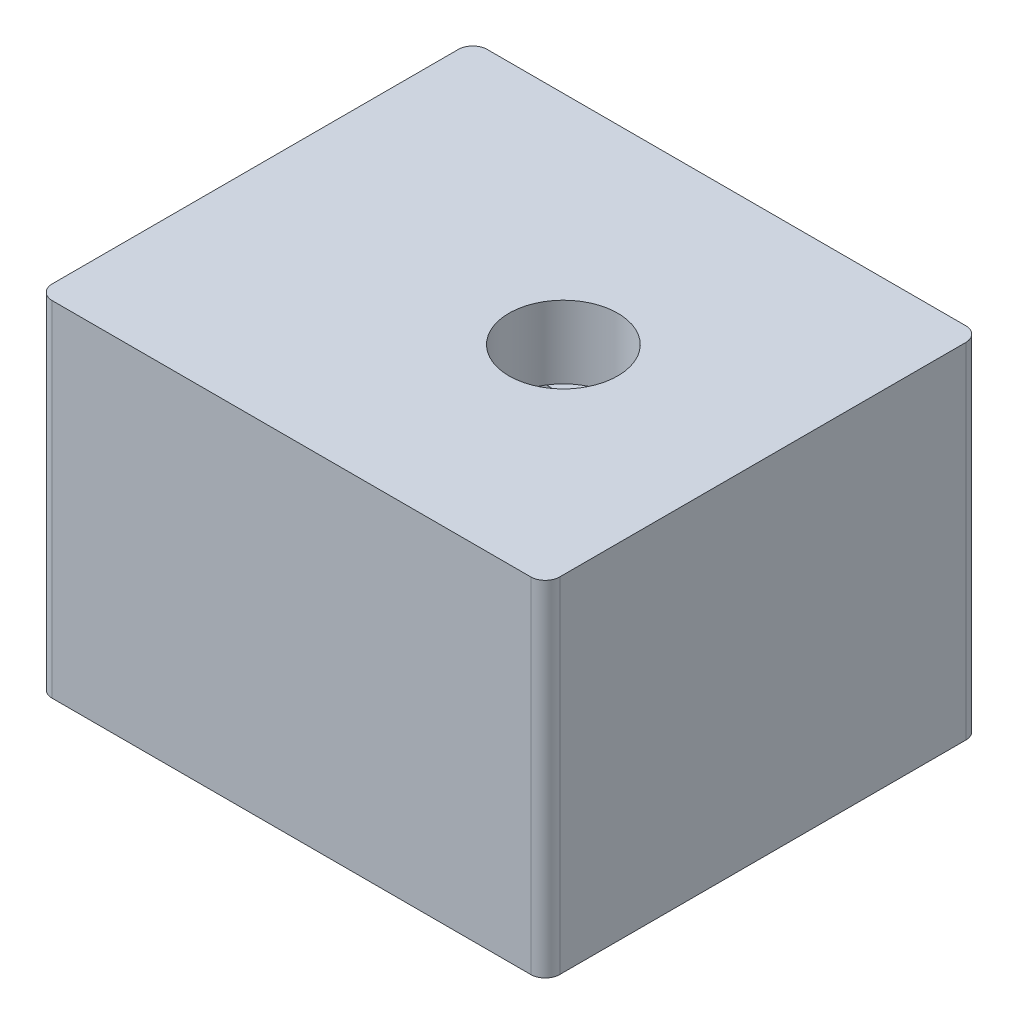
ISO-10303-21;
HEADER;
FILE_DESCRIPTION(('STEP AP214'),'2;1');
FILE_NAME('part.step','',(''),(''),'','','');
FILE_SCHEMA(('AUTOMOTIVE_DESIGN { 1 0 10303 214 1 1 1 1 }'));
ENDSEC;
DATA;
#1=APPLICATION_CONTEXT('core data for automotive mechanical design processes');
#2=APPLICATION_PROTOCOL_DEFINITION('international standard','automotive_design',2000,#1);
#3=PRODUCT_CONTEXT('',#1,'mechanical');
#4=PRODUCT('Part','Part','',(#3));
#5=PRODUCT_RELATED_PRODUCT_CATEGORY('part','',(#4));
#6=PRODUCT_DEFINITION_FORMATION('','',#4);
#7=PRODUCT_DEFINITION_CONTEXT('part definition',#1,'design');
#8=PRODUCT_DEFINITION('design','',#6,#7);
#9=PRODUCT_DEFINITION_SHAPE('','',#8);
#10=(LENGTH_UNIT() NAMED_UNIT(*) SI_UNIT(.MILLI.,.METRE.));
#11=(NAMED_UNIT(*) PLANE_ANGLE_UNIT() SI_UNIT($,.RADIAN.));
#12=(NAMED_UNIT(*) SI_UNIT($,.STERADIAN.) SOLID_ANGLE_UNIT());
#13=UNCERTAINTY_MEASURE_WITH_UNIT(LENGTH_MEASURE(1.E-05),#10,'distance_accuracy_value','');
#14=(GEOMETRIC_REPRESENTATION_CONTEXT(3) GLOBAL_UNCERTAINTY_ASSIGNED_CONTEXT((#13)) GLOBAL_UNIT_ASSIGNED_CONTEXT((#10,
#11,#12)) REPRESENTATION_CONTEXT('',''));
#15=CARTESIAN_POINT('',(0.,0.,0.));
#16=DIRECTION('',(0.,0.,1.));
#17=DIRECTION('',(1.,0.,0.));
#18=AXIS2_PLACEMENT_3D('',#15,#16,#17);
#19=CARTESIAN_POINT('',(-60.,20.,-50.));
#20=DIRECTION('',(0.,0.,-1.));
#21=DIRECTION('',(-1.,0.,0.));
#22=AXIS2_PLACEMENT_3D('',#19,#20,#21);
#23=PLANE('',#22);
#24=DIRECTION('',(0.,1.,0.));
#25=VECTOR('',#24,1.);
#26=CARTESIAN_POINT('',(-60.,20.,-50.));
#27=LINE('',#26,#25);
#28=CARTESIAN_POINT('',(-60.,42.0000000000001,-50.));
#29=VERTEX_POINT('',#28);
#30=CARTESIAN_POINT('',(-60.,70.,-50.));
#31=VERTEX_POINT('',#30);
#32=EDGE_CURVE('E243',#29,#31,#27,.T.);
#33=ORIENTED_EDGE('',*,*,#32,.F.);
#34=DIRECTION('',(1.,0.,0.));
#35=VECTOR('',#34,1.);
#36=CARTESIAN_POINT('',(-60.,42.0000000000001,-50.));
#37=LINE('',#36,#35);
#38=CARTESIAN_POINT('',(60.,42.,-50.));
#39=VERTEX_POINT('',#38);
#40=EDGE_CURVE('E193',#29,#39,#37,.T.);
#41=ORIENTED_EDGE('',*,*,#40,.T.);
#42=DIRECTION('',(0.,1.,0.));
#43=VECTOR('',#42,1.);
#44=CARTESIAN_POINT('',(60.,20.,-50.));
#45=LINE('',#44,#43);
#46=CARTESIAN_POINT('',(60.,70.,-50.));
#47=VERTEX_POINT('',#46);
#48=EDGE_CURVE('E247',#39,#47,#45,.T.);
#49=ORIENTED_EDGE('',*,*,#48,.T.);
#50=DIRECTION('',(-1.,0.,0.));
#51=VECTOR('',#50,1.);
#52=CARTESIAN_POINT('',(-60.,70.,-50.));
#53=LINE('',#52,#51);
#54=EDGE_CURVE('E221',#47,#31,#53,.T.);
#55=ORIENTED_EDGE('',*,*,#54,.T.);
#56=EDGE_LOOP('',(#33,#41,#49,#55));
#57=FACE_BOUND('',#56,.T.);
#58=ADVANCED_FACE('F37',(#57),#23,.F.);
#59=CARTESIAN_POINT('',(-60.,20.,-50.));
#60=DIRECTION('',(-1.,0.,0.));
#61=DIRECTION('',(0.,0.,1.));
#62=AXIS2_PLACEMENT_3D('',#59,#60,#61);
#63=PLANE('',#62);
#64=CARTESIAN_POINT('',(-60.,20.,-50.));
#65=VERTEX_POINT('',#64);
#66=CARTESIAN_POINT('',(-60.,28.,-50.));
#67=VERTEX_POINT('',#66);
#68=EDGE_CURVE('E159',#65,#67,#27,.T.);
#69=ORIENTED_EDGE('',*,*,#68,.T.);
#70=DIRECTION('',(0.,0.,1.));
#71=VECTOR('',#70,1.);
#72=CARTESIAN_POINT('',(-59.9999999999999,28.,-60.));
#73=LINE('',#72,#71);
#74=CARTESIAN_POINT('',(-59.9999999999999,28.,-60.));
#75=VERTEX_POINT('',#74);
#76=EDGE_CURVE('E151',#75,#67,#73,.T.);
#77=ORIENTED_EDGE('',*,*,#76,.F.);
#78=DIRECTION('',(0.,-1.,0.));
#79=VECTOR('',#78,1.);
#80=CARTESIAN_POINT('',(-60.,42.0000000000001,-60.));
#81=LINE('',#80,#79);
#82=CARTESIAN_POINT('',(-60.,42.0000000000001,-60.));
#83=VERTEX_POINT('',#82);
#84=EDGE_CURVE('E156',#83,#75,#81,.T.);
#85=ORIENTED_EDGE('',*,*,#84,.F.);
#86=DIRECTION('',(0.,0.,1.));
#87=VECTOR('',#86,1.);
#88=CARTESIAN_POINT('',(-60.,42.0000000000001,-60.));
#89=LINE('',#88,#87);
#90=EDGE_CURVE('E186',#83,#29,#89,.T.);
#91=ORIENTED_EDGE('',*,*,#90,.T.);
#92=ORIENTED_EDGE('',*,*,#32,.T.);
#93=DIRECTION('',(0.,0.,1.));
#94=VECTOR('',#93,1.);
#95=CARTESIAN_POINT('',(-60.,70.,-50.));
#96=LINE('',#95,#94);
#97=CARTESIAN_POINT('',(-60.,70.,50.));
#98=VERTEX_POINT('',#97);
#99=EDGE_CURVE('E212',#31,#98,#96,.T.);
#100=ORIENTED_EDGE('',*,*,#99,.T.);
#101=DIRECTION('',(0.,1.,0.));
#102=VECTOR('',#101,1.);
#103=CARTESIAN_POINT('',(-60.,20.,50.));
#104=LINE('',#103,#102);
#105=CARTESIAN_POINT('',(-60.,20.,50.));
#106=VERTEX_POINT('',#105);
#107=EDGE_CURVE('E230',#106,#98,#104,.T.);
#108=ORIENTED_EDGE('',*,*,#107,.F.);
#109=DIRECTION('',(0.,0.,1.));
#110=VECTOR('',#109,1.);
#111=CARTESIAN_POINT('',(-60.,20.,-50.));
#112=LINE('',#111,#110);
#113=EDGE_CURVE('E217',#65,#106,#112,.T.);
#114=ORIENTED_EDGE('',*,*,#113,.F.);
#115=EDGE_LOOP('',(#69,#77,#85,#91,#92,#100,#108,#114));
#116=FACE_BOUND('',#115,.T.);
#117=ADVANCED_FACE('F153',(#116),#63,.F.);
#118=CARTESIAN_POINT('',(60.,20.,-50.));
#119=VERTEX_POINT('',#118);
#120=CARTESIAN_POINT('',(60.,28.,-50.));
#121=VERTEX_POINT('',#120);
#122=EDGE_CURVE('E244',#119,#121,#45,.T.);
#123=ORIENTED_EDGE('',*,*,#122,.T.);
#124=DIRECTION('',(-1.,0.,0.));
#125=VECTOR('',#124,1.);
#126=CARTESIAN_POINT('',(-60.,28.,-50.));
#127=LINE('',#126,#125);
#128=EDGE_CURVE('E188',#121,#67,#127,.T.);
#129=ORIENTED_EDGE('',*,*,#128,.T.);
#130=ORIENTED_EDGE('',*,*,#68,.F.);
#131=DIRECTION('',(-1.,0.,0.));
#132=VECTOR('',#131,1.);
#133=CARTESIAN_POINT('',(-60.,20.,-50.));
#134=LINE('',#133,#132);
#135=EDGE_CURVE('E227',#119,#65,#134,.T.);
#136=ORIENTED_EDGE('',*,*,#135,.F.);
#137=EDGE_LOOP('',(#123,#129,#130,#136));
#138=FACE_BOUND('',#137,.T.);
#139=ADVANCED_FACE('F347',(#138),#23,.F.);
#140=CARTESIAN_POINT('',(60.,20.,-50.));
#141=DIRECTION('',(1.,0.,0.));
#142=DIRECTION('',(0.,0.,-1.));
#143=AXIS2_PLACEMENT_3D('',#140,#141,#142);
#144=PLANE('',#143);
#145=DIRECTION('',(0.,1.,0.));
#146=VECTOR('',#145,1.);
#147=CARTESIAN_POINT('',(60.,20.,50.));
#148=LINE('',#147,#146);
#149=CARTESIAN_POINT('',(60.,20.,50.));
#150=VERTEX_POINT('',#149);
#151=CARTESIAN_POINT('',(60.,70.,50.));
#152=VERTEX_POINT('',#151);
#153=EDGE_CURVE('E248',#150,#152,#148,.T.);
#154=ORIENTED_EDGE('',*,*,#153,.T.);
#155=DIRECTION('',(0.,0.,-1.));
#156=VECTOR('',#155,1.);
#157=CARTESIAN_POINT('',(60.,70.,-50.));
#158=LINE('',#157,#156);
#159=EDGE_CURVE('E236',#152,#47,#158,.T.);
#160=ORIENTED_EDGE('',*,*,#159,.T.);
#161=ORIENTED_EDGE('',*,*,#48,.F.);
#162=DIRECTION('',(0.,0.,1.));
#163=VECTOR('',#162,1.);
#164=CARTESIAN_POINT('',(60.,42.,-60.));
#165=LINE('',#164,#163);
#166=CARTESIAN_POINT('',(60.,42.,-60.));
#167=VERTEX_POINT('',#166);
#168=EDGE_CURVE('E189',#167,#39,#165,.T.);
#169=ORIENTED_EDGE('',*,*,#168,.F.);
#170=DIRECTION('',(0.,1.,0.));
#171=VECTOR('',#170,1.);
#172=CARTESIAN_POINT('',(60.,42.,-60.));
#173=LINE('',#172,#171);
#174=CARTESIAN_POINT('',(60.,28.,-60.));
#175=VERTEX_POINT('',#174);
#176=EDGE_CURVE('E172',#175,#167,#173,.T.);
#177=ORIENTED_EDGE('',*,*,#176,.F.);
#178=DIRECTION('',(0.,0.,1.));
#179=VECTOR('',#178,1.);
#180=CARTESIAN_POINT('',(60.,28.,-60.));
#181=LINE('',#180,#179);
#182=EDGE_CURVE('E162',#175,#121,#181,.T.);
#183=ORIENTED_EDGE('',*,*,#182,.T.);
#184=ORIENTED_EDGE('',*,*,#122,.F.);
#185=DIRECTION('',(0.,0.,-1.));
#186=VECTOR('',#185,1.);
#187=CARTESIAN_POINT('',(60.,20.,-50.));
#188=LINE('',#187,#186);
#189=EDGE_CURVE('E224',#150,#119,#188,.T.);
#190=ORIENTED_EDGE('',*,*,#189,.F.);
#191=EDGE_LOOP('',(#154,#160,#161,#169,#177,#183,#184,#190));
#192=FACE_BOUND('',#191,.T.);
#193=ADVANCED_FACE('F356',(#192),#144,.F.);
#194=CARTESIAN_POINT('',(-60.,20.,50.));
#195=DIRECTION('',(0.,0.,1.));
#196=DIRECTION('',(1.,0.,0.));
#197=AXIS2_PLACEMENT_3D('',#194,#195,#196);
#198=PLANE('',#197);
#199=ORIENTED_EDGE('',*,*,#107,.T.);
#200=DIRECTION('',(1.,0.,0.));
#201=VECTOR('',#200,1.);
#202=CARTESIAN_POINT('',(-60.,70.,50.));
#203=LINE('',#202,#201);
#204=EDGE_CURVE('E233',#98,#152,#203,.T.);
#205=ORIENTED_EDGE('',*,*,#204,.T.);
#206=ORIENTED_EDGE('',*,*,#153,.F.);
#207=DIRECTION('',(1.,0.,0.));
#208=VECTOR('',#207,1.);
#209=CARTESIAN_POINT('',(-60.,20.,50.));
#210=LINE('',#209,#208);
#211=EDGE_CURVE('E220',#106,#150,#210,.T.);
#212=ORIENTED_EDGE('',*,*,#211,.F.);
#213=EDGE_LOOP('',(#199,#205,#206,#212));
#214=FACE_BOUND('',#213,.T.);
#215=ADVANCED_FACE('F361',(#214),#198,.F.);
#216=CARTESIAN_POINT('',(0.,20.,0.));
#217=DIRECTION('',(0.,1.,0.));
#218=DIRECTION('',(0.,0.,1.));
#219=AXIS2_PLACEMENT_3D('',#216,#217,#218);
#220=PLANE('',#219);
#221=CARTESIAN_POINT('',(-15.,20.,0.));
#222=DIRECTION('',(0.,1.,0.));
#223=DIRECTION('',(0.,0.,1.));
#224=AXIS2_PLACEMENT_3D('',#221,#222,#223);
#225=CIRCLE('',#224,16.);
#226=CARTESIAN_POINT('',(-15.,20.,16.));
#227=VERTEX_POINT('',#226);
#228=EDGE_CURVE('E201',#227,#227,#225,.T.);
#229=ORIENTED_EDGE('',*,*,#228,.F.);
#230=EDGE_LOOP('',(#229));
#231=FACE_BOUND('',#230,.T.);
#232=CARTESIAN_POINT('',(15.,20.,0.));
#233=DIRECTION('',(0.,1.,0.));
#234=DIRECTION('',(0.,0.,1.));
#235=AXIS2_PLACEMENT_3D('',#232,#233,#234);
#236=CIRCLE('',#235,8.);
#237=CARTESIAN_POINT('',(15.,20.,8.));
#238=VERTEX_POINT('',#237);
#239=EDGE_CURVE('E196',#238,#238,#236,.T.);
#240=ORIENTED_EDGE('',*,*,#239,.F.);
#241=EDGE_LOOP('',(#240));
#242=FACE_BOUND('',#241,.T.);
#243=ORIENTED_EDGE('',*,*,#113,.T.);
#244=ORIENTED_EDGE('',*,*,#211,.T.);
#245=ORIENTED_EDGE('',*,*,#189,.T.);
#246=ORIENTED_EDGE('',*,*,#135,.T.);
#247=EDGE_LOOP('',(#243,#244,#245,#246));
#248=FACE_BOUND('',#247,.T.);
#249=ADVANCED_FACE('F366',(#231,#242,#248),#220,.T.);
#250=CARTESIAN_POINT('',(0.,70.,0.));
#251=DIRECTION('',(0.,1.,0.));
#252=DIRECTION('',(0.,0.,1.));
#253=AXIS2_PLACEMENT_3D('',#250,#251,#252);
#254=PLANE('',#253);
#255=CARTESIAN_POINT('',(15.,70.,0.));
#256=DIRECTION('',(0.,1.,0.));
#257=DIRECTION('',(0.,0.,1.));
#258=AXIS2_PLACEMENT_3D('',#255,#256,#257);
#259=CIRCLE('',#258,15.);
#260=CARTESIAN_POINT('',(15.,70.,15.));
#261=VERTEX_POINT('',#260);
#262=EDGE_CURVE('E429',#261,#261,#259,.F.);
#263=ORIENTED_EDGE('',*,*,#262,.F.);
#264=EDGE_LOOP('',(#263));
#265=FACE_BOUND('',#264,.T.);
#266=CARTESIAN_POINT('',(-15.,70.,0.));
#267=DIRECTION('',(0.,1.,0.));
#268=DIRECTION('',(0.,0.,1.));
#269=AXIS2_PLACEMENT_3D('',#266,#267,#268);
#270=CIRCLE('',#269,8.);
#271=CARTESIAN_POINT('',(-15.,70.,8.));
#272=VERTEX_POINT('',#271);
#273=EDGE_CURVE('E177',#272,#272,#270,.T.);
#274=ORIENTED_EDGE('',*,*,#273,.T.);
#275=EDGE_LOOP('',(#274));
#276=FACE_BOUND('',#275,.T.);
#277=ORIENTED_EDGE('',*,*,#99,.F.);
#278=ORIENTED_EDGE('',*,*,#54,.F.);
#279=ORIENTED_EDGE('',*,*,#159,.F.);
#280=ORIENTED_EDGE('',*,*,#204,.F.);
#281=EDGE_LOOP('',(#277,#278,#279,#280));
#282=FACE_BOUND('',#281,.T.);
#283=ADVANCED_FACE('F375',(#265,#276,#282),#254,.F.);
#284=CARTESIAN_POINT('',(15.,9.99999999999999,0.));
#285=DIRECTION('',(0.,1.,0.));
#286=DIRECTION('',(0.,0.,1.));
#287=AXIS2_PLACEMENT_3D('',#284,#285,#286);
#288=PLANE('',#287);
#289=CARTESIAN_POINT('',(15.,9.99999999999999,0.));
#290=DIRECTION('',(0.,1.,0.));
#291=DIRECTION('',(0.,0.,1.));
#292=AXIS2_PLACEMENT_3D('',#289,#290,#291);
#293=CIRCLE('',#292,8.);
#294=CARTESIAN_POINT('',(15.,9.99999999999999,8.));
#295=VERTEX_POINT('',#294);
#296=EDGE_CURVE('E204',#295,#295,#293,.T.);
#297=ORIENTED_EDGE('',*,*,#296,.T.);
#298=EDGE_LOOP('',(#297));
#299=FACE_BOUND('',#298,.T.);
#300=CARTESIAN_POINT('',(15.,9.99999999999999,0.));
#301=DIRECTION('',(0.,1.,0.));
#302=DIRECTION('',(0.,0.,1.));
#303=AXIS2_PLACEMENT_3D('',#300,#301,#302);
#304=CIRCLE('',#303,6.);
#305=CARTESIAN_POINT('',(15.,9.99999999999999,6.));
#306=VERTEX_POINT('',#305);
#307=EDGE_CURVE('E200',#306,#306,#304,.F.);
#308=ORIENTED_EDGE('',*,*,#307,.T.);
#309=EDGE_LOOP('',(#308));
#310=FACE_BOUND('',#309,.T.);
#311=ADVANCED_FACE('F403',(#299,#310),#288,.T.);
#312=CARTESIAN_POINT('',(15.,9.99999999999999,0.));
#313=DIRECTION('',(0.,1.,0.));
#314=DIRECTION('',(0.,0.,1.));
#315=AXIS2_PLACEMENT_3D('',#312,#313,#314);
#316=CYLINDRICAL_SURFACE('',#315,8.);
#317=ORIENTED_EDGE('',*,*,#296,.F.);
#318=EDGE_LOOP('',(#317));
#319=FACE_BOUND('',#318,.T.);
#320=ORIENTED_EDGE('',*,*,#239,.T.);
#321=EDGE_LOOP('',(#320));
#322=FACE_BOUND('',#321,.T.);
#323=ADVANCED_FACE('F397',(#319,#322),#316,.F.);
#324=CARTESIAN_POINT('',(-15.,9.99999999999999,0.));
#325=DIRECTION('',(0.,1.,0.));
#326=DIRECTION('',(0.,0.,1.));
#327=AXIS2_PLACEMENT_3D('',#324,#325,#326);
#328=PLANE('',#327);
#329=CARTESIAN_POINT('',(-15.,9.99999999999999,0.));
#330=DIRECTION('',(0.,1.,0.));
#331=DIRECTION('',(0.,0.,1.));
#332=AXIS2_PLACEMENT_3D('',#329,#330,#331);
#333=CIRCLE('',#332,16.);
#334=CARTESIAN_POINT('',(-15.,9.99999999999999,16.));
#335=VERTEX_POINT('',#334);
#336=EDGE_CURVE('E197',#335,#335,#333,.T.);
#337=ORIENTED_EDGE('',*,*,#336,.T.);
#338=EDGE_LOOP('',(#337));
#339=FACE_BOUND('',#338,.T.);
#340=CARTESIAN_POINT('',(-15.,9.99999999999999,0.));
#341=DIRECTION('',(0.,1.,0.));
#342=DIRECTION('',(0.,0.,1.));
#343=AXIS2_PLACEMENT_3D('',#340,#341,#342);
#344=CIRCLE('',#343,6.);
#345=CARTESIAN_POINT('',(-15.,9.99999999999999,6.));
#346=VERTEX_POINT('',#345);
#347=EDGE_CURVE('E216',#346,#346,#344,.F.);
#348=ORIENTED_EDGE('',*,*,#347,.T.);
#349=EDGE_LOOP('',(#348));
#350=FACE_BOUND('',#349,.T.);
#351=ADVANCED_FACE('F393',(#339,#350),#328,.T.);
#352=CARTESIAN_POINT('',(-15.,9.99999999999999,0.));
#353=DIRECTION('',(0.,1.,0.));
#354=DIRECTION('',(0.,0.,1.));
#355=AXIS2_PLACEMENT_3D('',#352,#353,#354);
#356=CYLINDRICAL_SURFACE('',#355,16.);
#357=ORIENTED_EDGE('',*,*,#336,.F.);
#358=EDGE_LOOP('',(#357));
#359=FACE_BOUND('',#358,.T.);
#360=ORIENTED_EDGE('',*,*,#228,.T.);
#361=EDGE_LOOP('',(#360));
#362=FACE_BOUND('',#361,.T.);
#363=ADVANCED_FACE('F396',(#359,#362),#356,.F.);
#364=CARTESIAN_POINT('',(15.,0.,0.));
#365=DIRECTION('',(0.,1.,0.));
#366=DIRECTION('',(0.,0.,1.));
#367=AXIS2_PLACEMENT_3D('',#364,#365,#366);
#368=PLANE('',#367);
#369=CARTESIAN_POINT('',(15.,0.,0.));
#370=DIRECTION('',(0.,1.,0.));
#371=DIRECTION('',(0.,0.,1.));
#372=AXIS2_PLACEMENT_3D('',#369,#370,#371);
#373=CIRCLE('',#372,6.);
#374=CARTESIAN_POINT('',(15.,0.,6.));
#375=VERTEX_POINT('',#374);
#376=EDGE_CURVE('E209',#375,#375,#373,.T.);
#377=ORIENTED_EDGE('',*,*,#376,.T.);
#378=EDGE_LOOP('',(#377));
#379=FACE_BOUND('',#378,.T.);
#380=ADVANCED_FACE('F401',(#379),#368,.T.);
#381=CARTESIAN_POINT('',(15.,0.,0.));
#382=DIRECTION('',(0.,1.,0.));
#383=DIRECTION('',(0.,0.,1.));
#384=AXIS2_PLACEMENT_3D('',#381,#382,#383);
#385=CYLINDRICAL_SURFACE('',#384,6.);
#386=ORIENTED_EDGE('',*,*,#376,.F.);
#387=EDGE_LOOP('',(#386));
#388=FACE_BOUND('',#387,.T.);
#389=ORIENTED_EDGE('',*,*,#307,.F.);
#390=EDGE_LOOP('',(#389));
#391=FACE_BOUND('',#390,.T.);
#392=ADVANCED_FACE('F412',(#388,#391),#385,.F.);
#393=CARTESIAN_POINT('',(-15.,0.,0.));
#394=DIRECTION('',(0.,-1.,0.));
#395=DIRECTION('',(0.,0.,-1.));
#396=AXIS2_PLACEMENT_3D('',#393,#394,#395);
#397=PLANE('',#396);
#398=CARTESIAN_POINT('',(-15.,0.,0.));
#399=DIRECTION('',(0.,1.,0.));
#400=DIRECTION('',(0.,0.,-1.));
#401=AXIS2_PLACEMENT_3D('',#398,#399,#400);
#402=CIRCLE('',#401,6.);
#403=CARTESIAN_POINT('',(-15.,0.,-6.));
#404=VERTEX_POINT('',#403);
#405=EDGE_CURVE('E213',#404,#404,#402,.T.);
#406=ORIENTED_EDGE('',*,*,#405,.T.);
#407=EDGE_LOOP('',(#406));
#408=FACE_BOUND('',#407,.T.);
#409=ADVANCED_FACE('F386',(#408),#397,.F.);
#410=CARTESIAN_POINT('',(-15.,0.,0.));
#411=DIRECTION('',(0.,1.,0.));
#412=DIRECTION('',(0.,0.,1.));
#413=AXIS2_PLACEMENT_3D('',#410,#411,#412);
#414=CYLINDRICAL_SURFACE('',#413,6.);
#415=ORIENTED_EDGE('',*,*,#405,.F.);
#416=EDGE_LOOP('',(#415));
#417=FACE_BOUND('',#416,.T.);
#418=ORIENTED_EDGE('',*,*,#347,.F.);
#419=EDGE_LOOP('',(#418));
#420=FACE_BOUND('',#419,.T.);
#421=ADVANCED_FACE('F379',(#417,#420),#414,.F.);
#422=CARTESIAN_POINT('',(-60.,42.0000000000001,-60.));
#423=DIRECTION('',(0.,1.,0.));
#424=DIRECTION('',(-1.,0.,0.));
#425=AXIS2_PLACEMENT_3D('',#422,#423,#424);
#426=PLANE('',#425);
#427=ORIENTED_EDGE('',*,*,#90,.F.);
#428=DIRECTION('',(-1.,0.,0.));
#429=VECTOR('',#428,1.);
#430=CARTESIAN_POINT('',(-60.,42.0000000000001,-60.));
#431=LINE('',#430,#429);
#432=EDGE_CURVE('E163',#167,#83,#431,.T.);
#433=ORIENTED_EDGE('',*,*,#432,.F.);
#434=ORIENTED_EDGE('',*,*,#168,.T.);
#435=ORIENTED_EDGE('',*,*,#40,.F.);
#436=EDGE_LOOP('',(#427,#433,#434,#435));
#437=FACE_BOUND('',#436,.T.);
#438=ADVANCED_FACE('F377',(#437),#426,.F.);
#439=CARTESIAN_POINT('',(-59.9999999999999,28.,-60.));
#440=DIRECTION('',(0.,-1.,0.));
#441=DIRECTION('',(1.,0.,0.));
#442=AXIS2_PLACEMENT_3D('',#439,#440,#441);
#443=PLANE('',#442);
#444=ORIENTED_EDGE('',*,*,#182,.F.);
#445=DIRECTION('',(1.,0.,0.));
#446=VECTOR('',#445,1.);
#447=CARTESIAN_POINT('',(-59.9999999999999,28.,-60.));
#448=LINE('',#447,#446);
#449=EDGE_CURVE('E167',#75,#175,#448,.T.);
#450=ORIENTED_EDGE('',*,*,#449,.F.);
#451=ORIENTED_EDGE('',*,*,#76,.T.);
#452=ORIENTED_EDGE('',*,*,#128,.F.);
#453=EDGE_LOOP('',(#444,#450,#451,#452));
#454=FACE_BOUND('',#453,.T.);
#455=ADVANCED_FACE('F168',(#454),#443,.F.);
#456=CARTESIAN_POINT('',(-70.,-5.,60.));
#457=DIRECTION('',(-1.,0.,0.));
#458=DIRECTION('',(0.,0.,1.));
#459=AXIS2_PLACEMENT_3D('',#456,#457,#458);
#460=PLANE('',#459);
#461=DIRECTION('',(0.,0.,1.));
#462=VECTOR('',#461,1.);
#463=CARTESIAN_POINT('',(-70.,90.,60.));
#464=LINE('',#463,#462);
#465=CARTESIAN_POINT('',(-70.,90.,-56.));
#466=VERTEX_POINT('',#465);
#467=CARTESIAN_POINT('',(-70.,90.,56.));
#468=VERTEX_POINT('',#467);
#469=EDGE_CURVE('E242',#466,#468,#464,.T.);
#470=ORIENTED_EDGE('',*,*,#469,.F.);
#471=DIRECTION('',(0.,1.,0.));
#472=VECTOR('',#471,1.);
#473=CARTESIAN_POINT('',(-70.,-5.,-56.));
#474=LINE('',#473,#472);
#475=CARTESIAN_POINT('',(-70.,-5.,-56.));
#476=VERTEX_POINT('',#475);
#477=EDGE_CURVE('E293',#466,#476,#474,.F.);
#478=ORIENTED_EDGE('',*,*,#477,.T.);
#479=DIRECTION('',(0.,0.,1.));
#480=VECTOR('',#479,1.);
#481=CARTESIAN_POINT('',(-70.,-5.,60.));
#482=LINE('',#481,#480);
#483=CARTESIAN_POINT('',(-70.,-5.,56.));
#484=VERTEX_POINT('',#483);
#485=EDGE_CURVE('E262',#476,#484,#482,.T.);
#486=ORIENTED_EDGE('',*,*,#485,.T.);
#487=DIRECTION('',(0.,1.,0.));
#488=VECTOR('',#487,1.);
#489=CARTESIAN_POINT('',(-70.,-5.,56.));
#490=LINE('',#489,#488);
#491=EDGE_CURVE('E290',#484,#468,#490,.T.);
#492=ORIENTED_EDGE('',*,*,#491,.T.);
#493=EDGE_LOOP('',(#470,#478,#486,#492));
#494=FACE_BOUND('',#493,.T.);
#495=ADVANCED_FACE('F327',(#494),#460,.T.);
#496=CARTESIAN_POINT('',(-70.,-5.,-60.));
#497=DIRECTION('',(0.,0.,-1.));
#498=DIRECTION('',(-1.,0.,0.));
#499=AXIS2_PLACEMENT_3D('',#496,#497,#498);
#500=PLANE('',#499);
#501=ORIENTED_EDGE('',*,*,#84,.T.);
#502=ORIENTED_EDGE('',*,*,#449,.T.);
#503=ORIENTED_EDGE('',*,*,#176,.T.);
#504=ORIENTED_EDGE('',*,*,#432,.T.);
#505=EDGE_LOOP('',(#501,#502,#503,#504));
#506=FACE_BOUND('',#505,.T.);
#507=DIRECTION('',(-1.,0.,0.));
#508=VECTOR('',#507,1.);
#509=CARTESIAN_POINT('',(-70.,-5.,-60.));
#510=LINE('',#509,#508);
#511=CARTESIAN_POINT('',(66.,-5.,-60.));
#512=VERTEX_POINT('',#511);
#513=CARTESIAN_POINT('',(-66.,-5.,-60.));
#514=VERTEX_POINT('',#513);
#515=EDGE_CURVE('E270',#512,#514,#510,.T.);
#516=ORIENTED_EDGE('',*,*,#515,.T.);
#517=DIRECTION('',(0.,1.,0.));
#518=VECTOR('',#517,1.);
#519=CARTESIAN_POINT('',(-66.,-5.,-60.));
#520=LINE('',#519,#518);
#521=CARTESIAN_POINT('',(-66.,90.,-60.));
#522=VERTEX_POINT('',#521);
#523=EDGE_CURVE('E279',#514,#522,#520,.T.);
#524=ORIENTED_EDGE('',*,*,#523,.T.);
#525=DIRECTION('',(-1.,0.,0.));
#526=VECTOR('',#525,1.);
#527=CARTESIAN_POINT('',(-70.,90.,-60.));
#528=LINE('',#527,#526);
#529=CARTESIAN_POINT('',(66.,90.,-60.));
#530=VERTEX_POINT('',#529);
#531=EDGE_CURVE('E259',#530,#522,#528,.T.);
#532=ORIENTED_EDGE('',*,*,#531,.F.);
#533=DIRECTION('',(0.,1.,0.));
#534=VECTOR('',#533,1.);
#535=CARTESIAN_POINT('',(66.,-5.,-60.));
#536=LINE('',#535,#534);
#537=EDGE_CURVE('E273',#530,#512,#536,.F.);
#538=ORIENTED_EDGE('',*,*,#537,.T.);
#539=EDGE_LOOP('',(#516,#524,#532,#538));
#540=FACE_BOUND('',#539,.T.);
#541=ADVANCED_FACE('F174',(#506,#540),#500,.T.);
#542=CARTESIAN_POINT('',(70.,-5.,60.));
#543=DIRECTION('',(1.,0.,0.));
#544=DIRECTION('',(0.,0.,-1.));
#545=AXIS2_PLACEMENT_3D('',#542,#543,#544);
#546=PLANE('',#545);
#547=DIRECTION('',(0.,0.,-1.));
#548=VECTOR('',#547,1.);
#549=CARTESIAN_POINT('',(70.,-5.,60.));
#550=LINE('',#549,#548);
#551=CARTESIAN_POINT('',(70.,-5.,56.));
#552=VERTEX_POINT('',#551);
#553=CARTESIAN_POINT('',(70.,-5.,-56.));
#554=VERTEX_POINT('',#553);
#555=EDGE_CURVE('E267',#552,#554,#550,.T.);
#556=ORIENTED_EDGE('',*,*,#555,.T.);
#557=DIRECTION('',(0.,1.,0.));
#558=VECTOR('',#557,1.);
#559=CARTESIAN_POINT('',(70.,-5.,-56.));
#560=LINE('',#559,#558);
#561=CARTESIAN_POINT('',(70.,90.,-56.));
#562=VERTEX_POINT('',#561);
#563=EDGE_CURVE('E304',#554,#562,#560,.T.);
#564=ORIENTED_EDGE('',*,*,#563,.T.);
#565=DIRECTION('',(0.,0.,-1.));
#566=VECTOR('',#565,1.);
#567=CARTESIAN_POINT('',(70.,90.,60.));
#568=LINE('',#567,#566);
#569=CARTESIAN_POINT('',(70.,90.,56.));
#570=VERTEX_POINT('',#569);
#571=EDGE_CURVE('E256',#570,#562,#568,.T.);
#572=ORIENTED_EDGE('',*,*,#571,.F.);
#573=DIRECTION('',(0.,1.,0.));
#574=VECTOR('',#573,1.);
#575=CARTESIAN_POINT('',(70.,-5.,56.));
#576=LINE('',#575,#574);
#577=EDGE_CURVE('E302',#570,#552,#576,.F.);
#578=ORIENTED_EDGE('',*,*,#577,.T.);
#579=EDGE_LOOP('',(#556,#564,#572,#578));
#580=FACE_BOUND('',#579,.T.);
#581=ADVANCED_FACE('F309',(#580),#546,.T.);
#582=CARTESIAN_POINT('',(-70.,-5.,60.));
#583=DIRECTION('',(0.,0.,1.));
#584=DIRECTION('',(1.,0.,0.));
#585=AXIS2_PLACEMENT_3D('',#582,#583,#584);
#586=PLANE('',#585);
#587=DIRECTION('',(1.,0.,0.));
#588=VECTOR('',#587,1.);
#589=CARTESIAN_POINT('',(-70.,-5.,60.));
#590=LINE('',#589,#588);
#591=CARTESIAN_POINT('',(-66.,-5.,60.));
#592=VERTEX_POINT('',#591);
#593=CARTESIAN_POINT('',(66.,-5.,60.));
#594=VERTEX_POINT('',#593);
#595=EDGE_CURVE('E265',#592,#594,#590,.T.);
#596=ORIENTED_EDGE('',*,*,#595,.T.);
#597=DIRECTION('',(0.,1.,0.));
#598=VECTOR('',#597,1.);
#599=CARTESIAN_POINT('',(66.,-5.,60.));
#600=LINE('',#599,#598);
#601=CARTESIAN_POINT('',(66.,90.,60.));
#602=VERTEX_POINT('',#601);
#603=EDGE_CURVE('E11',#594,#602,#600,.T.);
#604=ORIENTED_EDGE('',*,*,#603,.T.);
#605=DIRECTION('',(1.,0.,0.));
#606=VECTOR('',#605,1.);
#607=CARTESIAN_POINT('',(-70.,90.,60.));
#608=LINE('',#607,#606);
#609=CARTESIAN_POINT('',(-66.,90.,60.));
#610=VERTEX_POINT('',#609);
#611=EDGE_CURVE('E253',#610,#602,#608,.T.);
#612=ORIENTED_EDGE('',*,*,#611,.F.);
#613=DIRECTION('',(0.,1.,0.));
#614=VECTOR('',#613,1.);
#615=CARTESIAN_POINT('',(-66.,-5.,60.));
#616=LINE('',#615,#614);
#617=EDGE_CURVE('E45',#610,#592,#616,.F.);
#618=ORIENTED_EDGE('',*,*,#617,.T.);
#619=EDGE_LOOP('',(#596,#604,#612,#618));
#620=FACE_BOUND('',#619,.T.);
#621=ADVANCED_FACE('F319',(#620),#586,.T.);
#622=CARTESIAN_POINT('',(0.,-5.,0.));
#623=DIRECTION('',(0.,-1.,0.));
#624=DIRECTION('',(0.,0.,-1.));
#625=AXIS2_PLACEMENT_3D('',#622,#623,#624);
#626=PLANE('',#625);
#627=ORIENTED_EDGE('',*,*,#485,.F.);
#628=CARTESIAN_POINT('',(-66.,-5.,-56.));
#629=DIRECTION('',(0.,-1.,0.));
#630=DIRECTION('',(0.,0.,-1.));
#631=AXIS2_PLACEMENT_3D('',#628,#629,#630);
#632=CIRCLE('',#631,4.);
#633=EDGE_CURVE('E300',#476,#514,#632,.T.);
#634=ORIENTED_EDGE('',*,*,#633,.T.);
#635=ORIENTED_EDGE('',*,*,#515,.F.);
#636=CARTESIAN_POINT('',(66.,-5.,-56.));
#637=DIRECTION('',(0.,-1.,0.));
#638=DIRECTION('',(0.,0.,-1.));
#639=AXIS2_PLACEMENT_3D('',#636,#637,#638);
#640=CIRCLE('',#639,4.);
#641=EDGE_CURVE('E298',#512,#554,#640,.T.);
#642=ORIENTED_EDGE('',*,*,#641,.T.);
#643=ORIENTED_EDGE('',*,*,#555,.F.);
#644=CARTESIAN_POINT('',(66.,-5.,56.));
#645=DIRECTION('',(0.,-1.,0.));
#646=DIRECTION('',(0.,0.,-1.));
#647=AXIS2_PLACEMENT_3D('',#644,#645,#646);
#648=CIRCLE('',#647,4.);
#649=EDGE_CURVE('E52',#552,#594,#648,.T.);
#650=ORIENTED_EDGE('',*,*,#649,.T.);
#651=ORIENTED_EDGE('',*,*,#595,.F.);
#652=CARTESIAN_POINT('',(-66.,-5.,56.));
#653=DIRECTION('',(0.,-1.,0.));
#654=DIRECTION('',(0.,0.,-1.));
#655=AXIS2_PLACEMENT_3D('',#652,#653,#654);
#656=CIRCLE('',#655,4.);
#657=EDGE_CURVE('E295',#592,#484,#656,.T.);
#658=ORIENTED_EDGE('',*,*,#657,.T.);
#659=EDGE_LOOP('',(#627,#634,#635,#642,#643,#650,#651,#658));
#660=FACE_BOUND('',#659,.T.);
#661=ADVANCED_FACE('F322',(#660),#626,.T.);
#662=CARTESIAN_POINT('',(0.,90.,0.));
#663=DIRECTION('',(0.,-1.,0.));
#664=DIRECTION('',(0.,0.,-1.));
#665=AXIS2_PLACEMENT_3D('',#662,#663,#664);
#666=PLANE('',#665);
#667=CARTESIAN_POINT('',(15.,90.,0.));
#668=DIRECTION('',(0.,1.,0.));
#669=DIRECTION('',(0.,0.,1.));
#670=AXIS2_PLACEMENT_3D('',#667,#668,#669);
#671=CIRCLE('',#670,15.);
#672=CARTESIAN_POINT('',(15.,90.,15.));
#673=VERTEX_POINT('',#672);
#674=EDGE_CURVE('E438',#673,#673,#671,.T.);
#675=ORIENTED_EDGE('',*,*,#674,.F.);
#676=EDGE_LOOP('',(#675));
#677=FACE_BOUND('',#676,.T.);
#678=ORIENTED_EDGE('',*,*,#531,.T.);
#679=CARTESIAN_POINT('',(-66.,90.,-56.));
#680=DIRECTION('',(0.,-1.,0.));
#681=DIRECTION('',(0.,0.,-1.));
#682=AXIS2_PLACEMENT_3D('',#679,#680,#681);
#683=CIRCLE('',#682,4.);
#684=EDGE_CURVE('E288',#522,#466,#683,.F.);
#685=ORIENTED_EDGE('',*,*,#684,.T.);
#686=ORIENTED_EDGE('',*,*,#469,.T.);
#687=CARTESIAN_POINT('',(-66.,90.,56.));
#688=DIRECTION('',(0.,-1.,0.));
#689=DIRECTION('',(0.,0.,-1.));
#690=AXIS2_PLACEMENT_3D('',#687,#688,#689);
#691=CIRCLE('',#690,4.);
#692=EDGE_CURVE('E282',#468,#610,#691,.F.);
#693=ORIENTED_EDGE('',*,*,#692,.T.);
#694=ORIENTED_EDGE('',*,*,#611,.T.);
#695=CARTESIAN_POINT('',(66.,90.,56.));
#696=DIRECTION('',(0.,-1.,0.));
#697=DIRECTION('',(0.,0.,-1.));
#698=AXIS2_PLACEMENT_3D('',#695,#696,#697);
#699=CIRCLE('',#698,4.);
#700=EDGE_CURVE('E284',#602,#570,#699,.F.);
#701=ORIENTED_EDGE('',*,*,#700,.T.);
#702=ORIENTED_EDGE('',*,*,#571,.T.);
#703=CARTESIAN_POINT('',(66.,90.,-56.));
#704=DIRECTION('',(0.,-1.,0.));
#705=DIRECTION('',(0.,0.,-1.));
#706=AXIS2_PLACEMENT_3D('',#703,#704,#705);
#707=CIRCLE('',#706,4.);
#708=EDGE_CURVE('E286',#562,#530,#707,.F.);
#709=ORIENTED_EDGE('',*,*,#708,.T.);
#710=EDGE_LOOP('',(#678,#685,#686,#693,#694,#701,#702,#709));
#711=FACE_BOUND('',#710,.T.);
#712=ADVANCED_FACE('F314',(#677,#711),#666,.F.);
#713=CARTESIAN_POINT('',(-15.,70.,0.));
#714=DIRECTION('',(0.,1.,0.));
#715=DIRECTION('',(0.,0.,1.));
#716=AXIS2_PLACEMENT_3D('',#713,#714,#715);
#717=CYLINDRICAL_SURFACE('',#716,8.);
#718=ORIENTED_EDGE('',*,*,#273,.F.);
#719=EDGE_LOOP('',(#718));
#720=FACE_BOUND('',#719,.T.);
#721=CARTESIAN_POINT('',(-15.,80.,0.));
#722=DIRECTION('',(0.,1.,0.));
#723=DIRECTION('',(0.,0.,1.));
#724=AXIS2_PLACEMENT_3D('',#721,#722,#723);
#725=CIRCLE('',#724,8.);
#726=CARTESIAN_POINT('',(-15.,80.,8.));
#727=VERTEX_POINT('',#726);
#728=EDGE_CURVE('E180',#727,#727,#725,.T.);
#729=ORIENTED_EDGE('',*,*,#728,.T.);
#730=EDGE_LOOP('',(#729));
#731=FACE_BOUND('',#730,.T.);
#732=ADVANCED_FACE('F390',(#720,#731),#717,.F.);
#733=CARTESIAN_POINT('',(-15.,80.,0.));
#734=DIRECTION('',(0.,1.,0.));
#735=DIRECTION('',(0.,0.,1.));
#736=AXIS2_PLACEMENT_3D('',#733,#734,#735);
#737=PLANE('',#736);
#738=ORIENTED_EDGE('',*,*,#728,.F.);
#739=EDGE_LOOP('',(#738));
#740=FACE_BOUND('',#739,.T.);
#741=ADVANCED_FACE('F434',(#740),#737,.F.);
#742=CARTESIAN_POINT('',(15.,-5.00100000000001,0.));
#743=DIRECTION('',(0.,1.,0.));
#744=DIRECTION('',(0.,0.,1.));
#745=AXIS2_PLACEMENT_3D('',#742,#743,#744);
#746=CYLINDRICAL_SURFACE('',#745,15.);
#747=ORIENTED_EDGE('',*,*,#674,.T.);
#748=EDGE_LOOP('',(#747));
#749=FACE_BOUND('',#748,.T.);
#750=ORIENTED_EDGE('',*,*,#262,.T.);
#751=EDGE_LOOP('',(#750));
#752=FACE_BOUND('',#751,.T.);
#753=ADVANCED_FACE('F342',(#749,#752),#746,.F.);
#754=CARTESIAN_POINT('',(-66.,-5.,-56.));
#755=DIRECTION('',(0.,1.,0.));
#756=DIRECTION('',(0.,0.,1.));
#757=AXIS2_PLACEMENT_3D('',#754,#755,#756);
#758=CYLINDRICAL_SURFACE('',#757,4.);
#759=ORIENTED_EDGE('',*,*,#633,.F.);
#760=ORIENTED_EDGE('',*,*,#477,.F.);
#761=ORIENTED_EDGE('',*,*,#684,.F.);
#762=ORIENTED_EDGE('',*,*,#523,.F.);
#763=EDGE_LOOP('',(#759,#760,#761,#762));
#764=FACE_BOUND('',#763,.T.);
#765=ADVANCED_FACE('F332',(#764),#758,.T.);
#766=CARTESIAN_POINT('',(66.,-5.,-56.));
#767=DIRECTION('',(0.,1.,0.));
#768=DIRECTION('',(0.,0.,1.));
#769=AXIS2_PLACEMENT_3D('',#766,#767,#768);
#770=CYLINDRICAL_SURFACE('',#769,4.);
#771=ORIENTED_EDGE('',*,*,#641,.F.);
#772=ORIENTED_EDGE('',*,*,#537,.F.);
#773=ORIENTED_EDGE('',*,*,#708,.F.);
#774=ORIENTED_EDGE('',*,*,#563,.F.);
#775=EDGE_LOOP('',(#771,#772,#773,#774));
#776=FACE_BOUND('',#775,.T.);
#777=ADVANCED_FACE('F335',(#776),#770,.T.);
#778=CARTESIAN_POINT('',(66.,-5.,56.));
#779=DIRECTION('',(0.,1.,0.));
#780=DIRECTION('',(0.,0.,1.));
#781=AXIS2_PLACEMENT_3D('',#778,#779,#780);
#782=CYLINDRICAL_SURFACE('',#781,4.);
#783=ORIENTED_EDGE('',*,*,#649,.F.);
#784=ORIENTED_EDGE('',*,*,#577,.F.);
#785=ORIENTED_EDGE('',*,*,#700,.F.);
#786=ORIENTED_EDGE('',*,*,#603,.F.);
#787=EDGE_LOOP('',(#783,#784,#785,#786));
#788=FACE_BOUND('',#787,.T.);
#789=ADVANCED_FACE('F318',(#788),#782,.T.);
#790=CARTESIAN_POINT('',(-66.,-5.,56.));
#791=DIRECTION('',(0.,1.,0.));
#792=DIRECTION('',(0.,0.,1.));
#793=AXIS2_PLACEMENT_3D('',#790,#791,#792);
#794=CYLINDRICAL_SURFACE('',#793,4.);
#795=ORIENTED_EDGE('',*,*,#657,.F.);
#796=ORIENTED_EDGE('',*,*,#617,.F.);
#797=ORIENTED_EDGE('',*,*,#692,.F.);
#798=ORIENTED_EDGE('',*,*,#491,.F.);
#799=EDGE_LOOP('',(#795,#796,#797,#798));
#800=FACE_BOUND('',#799,.T.);
#801=ADVANCED_FACE('F39',(#800),#794,.T.);
#802=CLOSED_SHELL('',(#58,#117,#139,#193,#215,#249,#283,#311,#323,#351,#363,#380,#392,#409,#421,
#438,#455,#495,#541,#581,#621,#661,#712,#732,#741,#753,#765,#777,#789,#801));
#803=MANIFOLD_SOLID_BREP('B2',#802);
#804=ADVANCED_BREP_SHAPE_REPRESENTATION('',(#18,#803),#14);
#805=SHAPE_DEFINITION_REPRESENTATION(#9,#804);
ENDSEC;
END-ISO-10303-21;
